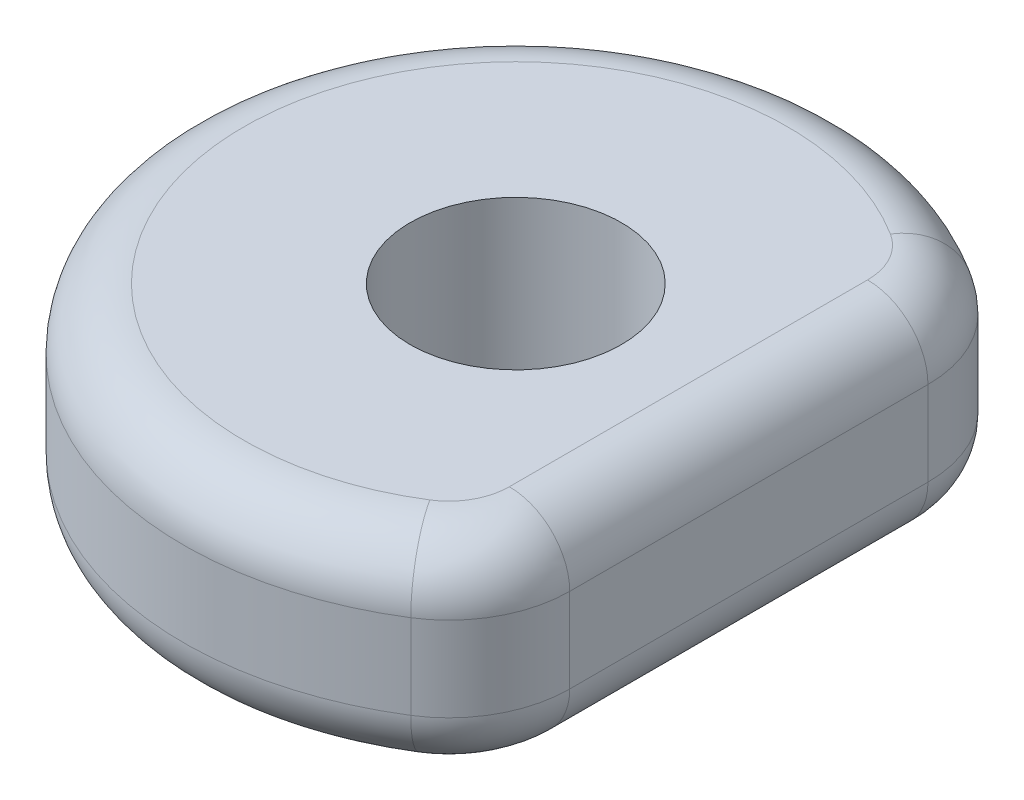
ISO-10303-21;
HEADER;
FILE_DESCRIPTION(('STEP AP214'),'2;1');
FILE_NAME('part.step','',(''),(''),'','','');
FILE_SCHEMA(('AUTOMOTIVE_DESIGN { 1 0 10303 214 1 1 1 1 }'));
ENDSEC;
DATA;
#1=APPLICATION_CONTEXT('core data for automotive mechanical design processes');
#2=APPLICATION_PROTOCOL_DEFINITION('international standard','automotive_design',2000,#1);
#3=PRODUCT_CONTEXT('',#1,'mechanical');
#4=PRODUCT('Part','Part','',(#3));
#5=PRODUCT_RELATED_PRODUCT_CATEGORY('part','',(#4));
#6=PRODUCT_DEFINITION_FORMATION('','',#4);
#7=PRODUCT_DEFINITION_CONTEXT('part definition',#1,'design');
#8=PRODUCT_DEFINITION('design','',#6,#7);
#9=PRODUCT_DEFINITION_SHAPE('','',#8);
#10=(LENGTH_UNIT() NAMED_UNIT(*) SI_UNIT(.MILLI.,.METRE.));
#11=(NAMED_UNIT(*) PLANE_ANGLE_UNIT() SI_UNIT($,.RADIAN.));
#12=(NAMED_UNIT(*) SI_UNIT($,.STERADIAN.) SOLID_ANGLE_UNIT());
#13=UNCERTAINTY_MEASURE_WITH_UNIT(LENGTH_MEASURE(1.E-05),#10,'distance_accuracy_value','');
#14=(GEOMETRIC_REPRESENTATION_CONTEXT(3) GLOBAL_UNCERTAINTY_ASSIGNED_CONTEXT((#13)) GLOBAL_UNIT_ASSIGNED_CONTEXT((#10,
#11,#12)) REPRESENTATION_CONTEXT('',''));
#15=CARTESIAN_POINT('',(0.,0.,0.));
#16=DIRECTION('',(0.,0.,1.));
#17=DIRECTION('',(1.,0.,0.));
#18=AXIS2_PLACEMENT_3D('',#15,#16,#17);
#19=CARTESIAN_POINT('',(0.,3.4,0.));
#20=DIRECTION('',(0.,1.,0.));
#21=DIRECTION('',(0.,0.,1.));
#22=AXIS2_PLACEMENT_3D('',#19,#20,#21);
#23=PLANE('',#22);
#24=DIRECTION('',(0.,0.,-1.));
#25=VECTOR('',#24,1.);
#26=CARTESIAN_POINT('',(2.85898782403715,3.4,-2.96549561963622));
#27=LINE('',#26,#25);
#28=CARTESIAN_POINT('',(2.85898782403715,3.4,2.96549561963622));
#29=VERTEX_POINT('',#28);
#30=CARTESIAN_POINT('',(2.85898782403715,3.4,-2.96549561963622));
#31=VERTEX_POINT('',#30);
#32=EDGE_CURVE('E142',#29,#31,#27,.T.);
#33=ORIENTED_EDGE('',*,*,#32,.T.);
#34=CARTESIAN_POINT('',(1.85898782403715,3.4,-2.96549561963622));
#35=DIRECTION('',(0.,1.,0.));
#36=DIRECTION('',(0.,0.,1.));
#37=AXIS2_PLACEMENT_3D('',#34,#35,#36);
#38=CIRCLE('',#37,1.);
#39=CARTESIAN_POINT('',(2.39012720233348,3.4,-3.81278008238943));
#40=VERTEX_POINT('',#39);
#41=EDGE_CURVE('E121',#31,#40,#38,.T.);
#42=ORIENTED_EDGE('',*,*,#41,.T.);
#43=CARTESIAN_POINT('',(0.,3.4,0.));
#44=DIRECTION('',(0.,1.,0.));
#45=DIRECTION('',(0.,0.,1.));
#46=AXIS2_PLACEMENT_3D('',#43,#44,#45);
#47=CIRCLE('',#46,4.5);
#48=CARTESIAN_POINT('',(2.39012720233348,3.4,3.81278008238943));
#49=VERTEX_POINT('',#48);
#50=EDGE_CURVE('E130',#40,#49,#47,.T.);
#51=ORIENTED_EDGE('',*,*,#50,.T.);
#52=CARTESIAN_POINT('',(1.85898782403715,3.4,2.96549561963622));
#53=DIRECTION('',(0.,1.,0.));
#54=DIRECTION('',(0.,0.,1.));
#55=AXIS2_PLACEMENT_3D('',#52,#53,#54);
#56=CIRCLE('',#55,1.);
#57=EDGE_CURVE('E137',#49,#29,#56,.T.);
#58=ORIENTED_EDGE('',*,*,#57,.T.);
#59=EDGE_LOOP('',(#33,#42,#51,#58));
#60=FACE_BOUND('',#59,.T.);
#61=CARTESIAN_POINT('',(0.,3.4,0.));
#62=DIRECTION('',(0.,1.,0.));
#63=DIRECTION('',(0.,0.,1.));
#64=AXIS2_PLACEMENT_3D('',#61,#62,#63);
#65=CIRCLE('',#64,1.75);
#66=CARTESIAN_POINT('',(0.,3.4,1.75));
#67=VERTEX_POINT('',#66);
#68=EDGE_CURVE('E231',#67,#67,#65,.T.);
#69=ORIENTED_EDGE('',*,*,#68,.F.);
#70=EDGE_LOOP('',(#69));
#71=FACE_BOUND('',#70,.T.);
#72=ADVANCED_FACE('F47',(#60,#71),#23,.T.);
#73=CARTESIAN_POINT('',(0.,0.,0.));
#74=DIRECTION('',(0.,1.,0.));
#75=DIRECTION('',(0.,0.,1.));
#76=AXIS2_PLACEMENT_3D('',#73,#74,#75);
#77=PLANE('',#76);
#78=CARTESIAN_POINT('',(0.,0.,0.));
#79=DIRECTION('',(0.,1.,0.));
#80=DIRECTION('',(0.,0.,1.));
#81=AXIS2_PLACEMENT_3D('',#78,#79,#80);
#82=CIRCLE('',#81,4.5);
#83=CARTESIAN_POINT('',(2.39012720233348,0.,3.81278008238943));
#84=VERTEX_POINT('',#83);
#85=CARTESIAN_POINT('',(2.39012720233348,0.,-3.81278008238943));
#86=VERTEX_POINT('',#85);
#87=EDGE_CURVE('E168',#84,#86,#82,.F.);
#88=ORIENTED_EDGE('',*,*,#87,.T.);
#89=CARTESIAN_POINT('',(1.85898782403715,0.,-2.96549561963622));
#90=DIRECTION('',(0.,1.,0.));
#91=DIRECTION('',(0.,0.,1.));
#92=AXIS2_PLACEMENT_3D('',#89,#90,#91);
#93=CIRCLE('',#92,1.);
#94=CARTESIAN_POINT('',(2.85898782403715,0.,-2.96549561963622));
#95=VERTEX_POINT('',#94);
#96=EDGE_CURVE('E176',#86,#95,#93,.F.);
#97=ORIENTED_EDGE('',*,*,#96,.T.);
#98=DIRECTION('',(0.,0.,-1.));
#99=VECTOR('',#98,1.);
#100=CARTESIAN_POINT('',(2.85898782403715,0.,0.));
#101=LINE('',#100,#99);
#102=CARTESIAN_POINT('',(2.85898782403715,0.,2.96549561963622));
#103=VERTEX_POINT('',#102);
#104=EDGE_CURVE('E72',#95,#103,#101,.F.);
#105=ORIENTED_EDGE('',*,*,#104,.T.);
#106=CARTESIAN_POINT('',(1.85898782403715,0.,2.96549561963622));
#107=DIRECTION('',(0.,1.,0.));
#108=DIRECTION('',(0.,0.,1.));
#109=AXIS2_PLACEMENT_3D('',#106,#107,#108);
#110=CIRCLE('',#109,1.);
#111=EDGE_CURVE('E171',#103,#84,#110,.F.);
#112=ORIENTED_EDGE('',*,*,#111,.T.);
#113=EDGE_LOOP('',(#88,#97,#105,#112));
#114=FACE_BOUND('',#113,.T.);
#115=CARTESIAN_POINT('',(0.,0.,0.));
#116=DIRECTION('',(0.,1.,0.));
#117=DIRECTION('',(0.,0.,1.));
#118=AXIS2_PLACEMENT_3D('',#115,#116,#117);
#119=CIRCLE('',#118,1.75);
#120=CARTESIAN_POINT('',(0.,0.,1.75));
#121=VERTEX_POINT('',#120);
#122=EDGE_CURVE('E189',#121,#121,#119,.T.);
#123=ORIENTED_EDGE('',*,*,#122,.T.);
#124=EDGE_LOOP('',(#123));
#125=FACE_BOUND('',#124,.T.);
#126=ADVANCED_FACE('F248',(#114,#125),#77,.F.);
#127=CARTESIAN_POINT('',(0.,3.4,0.));
#128=DIRECTION('',(0.,-1.,0.));
#129=DIRECTION('',(0.,0.,-1.));
#130=AXIS2_PLACEMENT_3D('',#127,#128,#129);
#131=CYLINDRICAL_SURFACE('',#130,5.5);
#132=DIRECTION('',(0.,-1.,0.));
#133=VECTOR('',#132,1.);
#134=CARTESIAN_POINT('',(2.92126658062981,3.4,4.66006454514263));
#135=LINE('',#134,#133);
#136=CARTESIAN_POINT('',(2.92126658062981,1.,4.66006454514263));
#137=VERTEX_POINT('',#136);
#138=CARTESIAN_POINT('',(2.92126658062981,2.4,4.66006454514263));
#139=VERTEX_POINT('',#138);
#140=EDGE_CURVE('E138',#137,#139,#135,.F.);
#141=ORIENTED_EDGE('',*,*,#140,.T.);
#142=CARTESIAN_POINT('',(0.,2.4,0.));
#143=DIRECTION('',(0.,1.,0.));
#144=DIRECTION('',(0.,0.,1.));
#145=AXIS2_PLACEMENT_3D('',#142,#143,#144);
#146=CIRCLE('',#145,5.5);
#147=CARTESIAN_POINT('',(2.92126658062981,2.4,-4.66006454514263));
#148=VERTEX_POINT('',#147);
#149=EDGE_CURVE('E11',#139,#148,#146,.F.);
#150=ORIENTED_EDGE('',*,*,#149,.T.);
#151=DIRECTION('',(0.,-1.,0.));
#152=VECTOR('',#151,1.);
#153=CARTESIAN_POINT('',(2.92126658062981,3.4,-4.66006454514263));
#154=LINE('',#153,#152);
#155=CARTESIAN_POINT('',(2.92126658062981,1.,-4.66006454514263));
#156=VERTEX_POINT('',#155);
#157=EDGE_CURVE('E224',#148,#156,#154,.T.);
#158=ORIENTED_EDGE('',*,*,#157,.T.);
#159=CARTESIAN_POINT('',(0.,1.,0.));
#160=DIRECTION('',(0.,1.,0.));
#161=DIRECTION('',(0.,0.,1.));
#162=AXIS2_PLACEMENT_3D('',#159,#160,#161);
#163=CIRCLE('',#162,5.5);
#164=EDGE_CURVE('E57',#156,#137,#163,.T.);
#165=ORIENTED_EDGE('',*,*,#164,.T.);
#166=EDGE_LOOP('',(#141,#150,#158,#165));
#167=FACE_BOUND('',#166,.T.);
#168=ADVANCED_FACE('F246',(#167),#131,.T.);
#169=CARTESIAN_POINT('',(3.85898782403715,3.4,-3.91895559734134));
#170=DIRECTION('',(-1.,0.,0.));
#171=DIRECTION('',(0.,0.,1.));
#172=AXIS2_PLACEMENT_3D('',#169,#170,#171);
#173=PLANE('',#172);
#174=DIRECTION('',(0.,-1.,0.));
#175=VECTOR('',#174,1.);
#176=CARTESIAN_POINT('',(3.85898782403715,3.4,-2.96549561963622));
#177=LINE('',#176,#175);
#178=CARTESIAN_POINT('',(3.85898782403715,1.,-2.96549561963622));
#179=VERTEX_POINT('',#178);
#180=CARTESIAN_POINT('',(3.85898782403715,2.4,-2.96549561963622));
#181=VERTEX_POINT('',#180);
#182=EDGE_CURVE('E225',#179,#181,#177,.F.);
#183=ORIENTED_EDGE('',*,*,#182,.T.);
#184=DIRECTION('',(0.,0.,-1.));
#185=VECTOR('',#184,1.);
#186=CARTESIAN_POINT('',(3.85898782403715,2.4,2.96549561963622));
#187=LINE('',#186,#185);
#188=CARTESIAN_POINT('',(3.85898782403715,2.4,2.96549561963622));
#189=VERTEX_POINT('',#188);
#190=EDGE_CURVE('E159',#181,#189,#187,.F.);
#191=ORIENTED_EDGE('',*,*,#190,.T.);
#192=DIRECTION('',(0.,-1.,0.));
#193=VECTOR('',#192,1.);
#194=CARTESIAN_POINT('',(3.85898782403715,3.4,2.96549561963622));
#195=LINE('',#194,#193);
#196=CARTESIAN_POINT('',(3.85898782403715,1.,2.96549561963622));
#197=VERTEX_POINT('',#196);
#198=EDGE_CURVE('E215',#189,#197,#195,.T.);
#199=ORIENTED_EDGE('',*,*,#198,.T.);
#200=DIRECTION('',(0.,0.,-1.));
#201=VECTOR('',#200,1.);
#202=CARTESIAN_POINT('',(3.85898782403715,1.,-3.91895559734134));
#203=LINE('',#202,#201);
#204=EDGE_CURVE('E156',#197,#179,#203,.T.);
#205=ORIENTED_EDGE('',*,*,#204,.T.);
#206=EDGE_LOOP('',(#183,#191,#199,#205));
#207=FACE_BOUND('',#206,.T.);
#208=ADVANCED_FACE('F220',(#207),#173,.F.);
#209=CARTESIAN_POINT('',(0.,3.4,0.));
#210=DIRECTION('',(0.,-1.,0.));
#211=DIRECTION('',(0.,0.,-1.));
#212=AXIS2_PLACEMENT_3D('',#209,#210,#211);
#213=CYLINDRICAL_SURFACE('',#212,1.75);
#214=ORIENTED_EDGE('',*,*,#68,.T.);
#215=EDGE_LOOP('',(#214));
#216=FACE_BOUND('',#215,.T.);
#217=ORIENTED_EDGE('',*,*,#122,.F.);
#218=EDGE_LOOP('',(#217));
#219=FACE_BOUND('',#218,.T.);
#220=ADVANCED_FACE('F254',(#216,#219),#213,.F.);
#221=CARTESIAN_POINT('',(1.85898782403715,3.4,2.96549561963622));
#222=DIRECTION('',(0.,-1.,0.));
#223=DIRECTION('',(0.,0.,-1.));
#224=AXIS2_PLACEMENT_3D('',#221,#222,#223);
#225=CYLINDRICAL_SURFACE('',#224,2.);
#226=ORIENTED_EDGE('',*,*,#198,.F.);
#227=CARTESIAN_POINT('',(1.85898782403715,2.4,2.96549561963622));
#228=DIRECTION('',(0.,1.,0.));
#229=DIRECTION('',(0.,0.,1.));
#230=AXIS2_PLACEMENT_3D('',#227,#228,#229);
#231=CIRCLE('',#230,2.);
#232=EDGE_CURVE('E165',#189,#139,#231,.F.);
#233=ORIENTED_EDGE('',*,*,#232,.T.);
#234=ORIENTED_EDGE('',*,*,#140,.F.);
#235=CARTESIAN_POINT('',(1.85898782403715,1.,2.96549561963622));
#236=DIRECTION('',(0.,1.,0.));
#237=DIRECTION('',(0.,0.,1.));
#238=AXIS2_PLACEMENT_3D('',#235,#236,#237);
#239=CIRCLE('',#238,2.);
#240=EDGE_CURVE('E162',#137,#197,#239,.T.);
#241=ORIENTED_EDGE('',*,*,#240,.T.);
#242=EDGE_LOOP('',(#226,#233,#234,#241));
#243=FACE_BOUND('',#242,.T.);
#244=ADVANCED_FACE('F214',(#243),#225,.T.);
#245=CARTESIAN_POINT('',(1.85898782403715,3.4,-2.96549561963622));
#246=DIRECTION('',(0.,-1.,0.));
#247=DIRECTION('',(0.,0.,-1.));
#248=AXIS2_PLACEMENT_3D('',#245,#246,#247);
#249=CYLINDRICAL_SURFACE('',#248,2.);
#250=ORIENTED_EDGE('',*,*,#157,.F.);
#251=CARTESIAN_POINT('',(1.85898782403715,2.4,-2.96549561963622));
#252=DIRECTION('',(0.,1.,0.));
#253=DIRECTION('',(0.,0.,1.));
#254=AXIS2_PLACEMENT_3D('',#251,#252,#253);
#255=CIRCLE('',#254,2.);
#256=EDGE_CURVE('E123',#148,#181,#255,.F.);
#257=ORIENTED_EDGE('',*,*,#256,.T.);
#258=ORIENTED_EDGE('',*,*,#182,.F.);
#259=CARTESIAN_POINT('',(1.85898782403715,1.,-2.96549561963622));
#260=DIRECTION('',(0.,1.,0.));
#261=DIRECTION('',(0.,0.,1.));
#262=AXIS2_PLACEMENT_3D('',#259,#260,#261);
#263=CIRCLE('',#262,2.);
#264=EDGE_CURVE('E145',#179,#156,#263,.T.);
#265=ORIENTED_EDGE('',*,*,#264,.T.);
#266=EDGE_LOOP('',(#250,#257,#258,#265));
#267=FACE_BOUND('',#266,.T.);
#268=ADVANCED_FACE('F244',(#267),#249,.T.);
#269=CARTESIAN_POINT('',(1.85898782403715,2.4,2.96549561963622));
#270=DIRECTION('',(0.,1.,0.));
#271=DIRECTION('',(0.,0.,1.));
#272=AXIS2_PLACEMENT_3D('',#269,#270,#271);
#273=DEGENERATE_TOROIDAL_SURFACE('',#272,1.,1.,.T.);
#274=CARTESIAN_POINT('',(2.39012720233348,2.4,3.81278008238943));
#275=DIRECTION('',(-0.847284462753206,0.,0.531139378296329));
#276=DIRECTION('',(0.531139378296329,0.,0.847284462753206));
#277=AXIS2_PLACEMENT_3D('',#274,#275,#276);
#278=CIRCLE('',#277,1.);
#279=EDGE_CURVE('E133',#139,#49,#278,.T.);
#280=ORIENTED_EDGE('',*,*,#279,.F.);
#281=ORIENTED_EDGE('',*,*,#232,.F.);
#282=CARTESIAN_POINT('',(2.85898782403715,2.4,2.96549561963622));
#283=DIRECTION('',(0.,0.,-1.));
#284=DIRECTION('',(-1.,0.,0.));
#285=AXIS2_PLACEMENT_3D('',#282,#283,#284);
#286=CIRCLE('',#285,1.);
#287=EDGE_CURVE('E185',#29,#189,#286,.T.);
#288=ORIENTED_EDGE('',*,*,#287,.F.);
#289=ORIENTED_EDGE('',*,*,#57,.F.);
#290=EDGE_LOOP('',(#280,#281,#288,#289));
#291=FACE_BOUND('',#290,.T.);
#292=ADVANCED_FACE('F239',(#291),#273,.T.);
#293=CARTESIAN_POINT('',(2.85898782403715,2.4,0.));
#294=DIRECTION('',(0.,0.,1.));
#295=DIRECTION('',(1.,0.,0.));
#296=AXIS2_PLACEMENT_3D('',#293,#294,#295);
#297=CYLINDRICAL_SURFACE('',#296,1.);
#298=ORIENTED_EDGE('',*,*,#287,.T.);
#299=ORIENTED_EDGE('',*,*,#190,.F.);
#300=CARTESIAN_POINT('',(2.85898782403715,2.4,-2.96549561963622));
#301=DIRECTION('',(0.,0.,-1.));
#302=DIRECTION('',(-1.,0.,0.));
#303=AXIS2_PLACEMENT_3D('',#300,#301,#302);
#304=CIRCLE('',#303,1.);
#305=EDGE_CURVE('E127',#31,#181,#304,.T.);
#306=ORIENTED_EDGE('',*,*,#305,.F.);
#307=ORIENTED_EDGE('',*,*,#32,.F.);
#308=EDGE_LOOP('',(#298,#299,#306,#307));
#309=FACE_BOUND('',#308,.T.);
#310=ADVANCED_FACE('F241',(#309),#297,.T.);
#311=CARTESIAN_POINT('',(0.,2.4,0.));
#312=DIRECTION('',(0.,1.,0.));
#313=DIRECTION('',(0.,0.,1.));
#314=AXIS2_PLACEMENT_3D('',#311,#312,#313);
#315=TOROIDAL_SURFACE('',#314,4.5,1.);
#316=ORIENTED_EDGE('',*,*,#279,.T.);
#317=ORIENTED_EDGE('',*,*,#50,.F.);
#318=CARTESIAN_POINT('',(2.39012720233348,2.4,-3.81278008238943));
#319=DIRECTION('',(0.847284462753206,0.,0.531139378296329));
#320=DIRECTION('',(0.531139378296329,0.,-0.847284462753206));
#321=AXIS2_PLACEMENT_3D('',#318,#319,#320);
#322=CIRCLE('',#321,1.);
#323=EDGE_CURVE('E117',#148,#40,#322,.T.);
#324=ORIENTED_EDGE('',*,*,#323,.F.);
#325=ORIENTED_EDGE('',*,*,#149,.F.);
#326=EDGE_LOOP('',(#316,#317,#324,#325));
#327=FACE_BOUND('',#326,.T.);
#328=ADVANCED_FACE('F131',(#327),#315,.T.);
#329=CARTESIAN_POINT('',(1.85898782403715,2.4,-2.96549561963622));
#330=DIRECTION('',(0.,1.,0.));
#331=DIRECTION('',(0.,0.,1.));
#332=AXIS2_PLACEMENT_3D('',#329,#330,#331);
#333=DEGENERATE_TOROIDAL_SURFACE('',#332,1.,1.,.T.);
#334=ORIENTED_EDGE('',*,*,#305,.T.);
#335=ORIENTED_EDGE('',*,*,#256,.F.);
#336=ORIENTED_EDGE('',*,*,#323,.T.);
#337=ORIENTED_EDGE('',*,*,#41,.F.);
#338=EDGE_LOOP('',(#334,#335,#336,#337));
#339=FACE_BOUND('',#338,.T.);
#340=ADVANCED_FACE('F119',(#339),#333,.T.);
#341=CARTESIAN_POINT('',(1.85898782403715,1.,2.96549561963622));
#342=DIRECTION('',(0.,1.,0.));
#343=DIRECTION('',(0.,0.,1.));
#344=AXIS2_PLACEMENT_3D('',#341,#342,#343);
#345=DEGENERATE_TOROIDAL_SURFACE('',#344,1.,1.,.T.);
#346=CARTESIAN_POINT('',(2.85898782403715,1.,2.96549561963622));
#347=DIRECTION('',(0.,0.,-1.));
#348=DIRECTION('',(-1.,0.,0.));
#349=AXIS2_PLACEMENT_3D('',#346,#347,#348);
#350=CIRCLE('',#349,1.);
#351=EDGE_CURVE('E194',#197,#103,#350,.T.);
#352=ORIENTED_EDGE('',*,*,#351,.F.);
#353=ORIENTED_EDGE('',*,*,#240,.F.);
#354=CARTESIAN_POINT('',(2.39012720233348,1.,3.81278008238943));
#355=DIRECTION('',(-0.847284462753206,0.,0.531139378296329));
#356=DIRECTION('',(0.531139378296329,0.,0.847284462753206));
#357=AXIS2_PLACEMENT_3D('',#354,#355,#356);
#358=CIRCLE('',#357,1.);
#359=EDGE_CURVE('E51',#84,#137,#358,.T.);
#360=ORIENTED_EDGE('',*,*,#359,.F.);
#361=ORIENTED_EDGE('',*,*,#111,.F.);
#362=EDGE_LOOP('',(#352,#353,#360,#361));
#363=FACE_BOUND('',#362,.T.);
#364=ADVANCED_FACE('F49',(#363),#345,.T.);
#365=CARTESIAN_POINT('',(0.,1.,0.));
#366=DIRECTION('',(0.,1.,0.));
#367=DIRECTION('',(0.,0.,1.));
#368=AXIS2_PLACEMENT_3D('',#365,#366,#367);
#369=TOROIDAL_SURFACE('',#368,4.5,1.);
#370=ORIENTED_EDGE('',*,*,#359,.T.);
#371=ORIENTED_EDGE('',*,*,#164,.F.);
#372=CARTESIAN_POINT('',(2.39012720233348,1.,-3.81278008238943));
#373=DIRECTION('',(0.847284462753206,0.,0.531139378296329));
#374=DIRECTION('',(0.531139378296329,0.,-0.847284462753206));
#375=AXIS2_PLACEMENT_3D('',#372,#373,#374);
#376=CIRCLE('',#375,1.);
#377=EDGE_CURVE('E192',#86,#156,#376,.T.);
#378=ORIENTED_EDGE('',*,*,#377,.F.);
#379=ORIENTED_EDGE('',*,*,#87,.F.);
#380=EDGE_LOOP('',(#370,#371,#378,#379));
#381=FACE_BOUND('',#380,.T.);
#382=ADVANCED_FACE('F206',(#381),#369,.T.);
#383=CARTESIAN_POINT('',(2.85898782403715,1.,-3.91895559734134));
#384=DIRECTION('',(0.,0.,-1.));
#385=DIRECTION('',(-1.,0.,0.));
#386=AXIS2_PLACEMENT_3D('',#383,#384,#385);
#387=CYLINDRICAL_SURFACE('',#386,1.);
#388=ORIENTED_EDGE('',*,*,#351,.T.);
#389=ORIENTED_EDGE('',*,*,#104,.F.);
#390=CARTESIAN_POINT('',(2.85898782403715,1.,-2.96549561963622));
#391=DIRECTION('',(0.,0.,-1.));
#392=DIRECTION('',(-1.,0.,0.));
#393=AXIS2_PLACEMENT_3D('',#390,#391,#392);
#394=CIRCLE('',#393,1.);
#395=EDGE_CURVE('E65',#179,#95,#394,.T.);
#396=ORIENTED_EDGE('',*,*,#395,.F.);
#397=ORIENTED_EDGE('',*,*,#204,.F.);
#398=EDGE_LOOP('',(#388,#389,#396,#397));
#399=FACE_BOUND('',#398,.T.);
#400=ADVANCED_FACE('F293',(#399),#387,.T.);
#401=CARTESIAN_POINT('',(1.85898782403715,1.,-2.96549561963622));
#402=DIRECTION('',(0.,1.,0.));
#403=DIRECTION('',(0.,0.,1.));
#404=AXIS2_PLACEMENT_3D('',#401,#402,#403);
#405=DEGENERATE_TOROIDAL_SURFACE('',#404,1.,1.,.T.);
#406=ORIENTED_EDGE('',*,*,#377,.T.);
#407=ORIENTED_EDGE('',*,*,#264,.F.);
#408=ORIENTED_EDGE('',*,*,#395,.T.);
#409=ORIENTED_EDGE('',*,*,#96,.F.);
#410=EDGE_LOOP('',(#406,#407,#408,#409));
#411=FACE_BOUND('',#410,.T.);
#412=ADVANCED_FACE('F290',(#411),#405,.T.);
#413=CLOSED_SHELL('',(#72,#126,#168,#208,#220,#244,#268,#292,#310,#328,#340,#364,#382,#400,#412));
#414=MANIFOLD_SOLID_BREP('B2',#413);
#415=ADVANCED_BREP_SHAPE_REPRESENTATION('',(#18,#414),#14);
#416=SHAPE_DEFINITION_REPRESENTATION(#9,#415);
ENDSEC;
END-ISO-10303-21;
